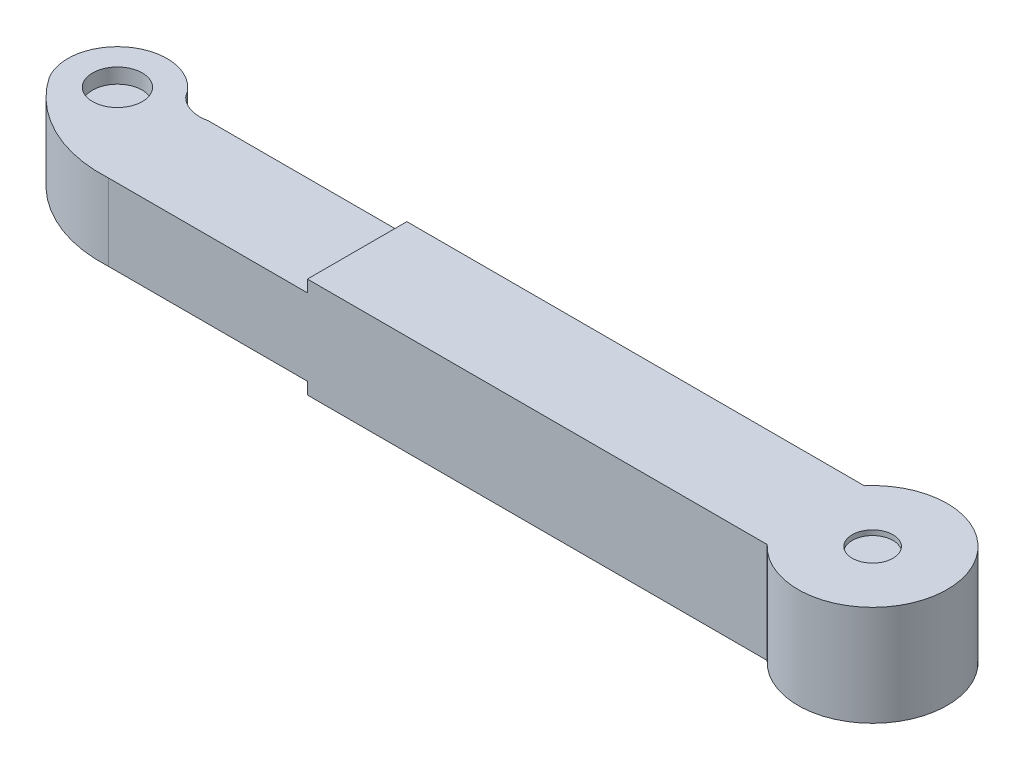
ISO-10303-21;
HEADER;
FILE_DESCRIPTION(('STEP AP214'),'2;1');
FILE_NAME('part.step','',(''),(''),'','','');
FILE_SCHEMA(('AUTOMOTIVE_DESIGN { 1 0 10303 214 1 1 1 1 }'));
ENDSEC;
DATA;
#1=APPLICATION_CONTEXT('core data for automotive mechanical design processes');
#2=APPLICATION_PROTOCOL_DEFINITION('international standard','automotive_design',2000,#1);
#3=PRODUCT_CONTEXT('',#1,'mechanical');
#4=PRODUCT('Part','Part','',(#3));
#5=PRODUCT_RELATED_PRODUCT_CATEGORY('part','',(#4));
#6=PRODUCT_DEFINITION_FORMATION('','',#4);
#7=PRODUCT_DEFINITION_CONTEXT('part definition',#1,'design');
#8=PRODUCT_DEFINITION('design','',#6,#7);
#9=PRODUCT_DEFINITION_SHAPE('','',#8);
#10=(LENGTH_UNIT() NAMED_UNIT(*) SI_UNIT(.MILLI.,.METRE.));
#11=(NAMED_UNIT(*) PLANE_ANGLE_UNIT() SI_UNIT($,.RADIAN.));
#12=(NAMED_UNIT(*) SI_UNIT($,.STERADIAN.) SOLID_ANGLE_UNIT());
#13=UNCERTAINTY_MEASURE_WITH_UNIT(LENGTH_MEASURE(1.E-05),#10,'distance_accuracy_value','');
#14=(GEOMETRIC_REPRESENTATION_CONTEXT(3) GLOBAL_UNCERTAINTY_ASSIGNED_CONTEXT((#13)) GLOBAL_UNIT_ASSIGNED_CONTEXT((#10,
#11,#12)) REPRESENTATION_CONTEXT('',''));
#15=CARTESIAN_POINT('',(0.,0.,0.));
#16=DIRECTION('',(0.,0.,1.));
#17=DIRECTION('',(1.,0.,0.));
#18=AXIS2_PLACEMENT_3D('',#15,#16,#17);
#19=CARTESIAN_POINT('',(33.3628123958381,10.1,5.01996462768105));
#20=DIRECTION('',(0.,0.,-1.));
#21=DIRECTION('',(-1.,0.,0.));
#22=AXIS2_PLACEMENT_3D('',#19,#20,#21);
#23=PLANE('',#22);
#24=DIRECTION('',(1.,0.,0.));
#25=VECTOR('',#24,1.);
#26=CARTESIAN_POINT('',(-32.8682334573051,1.2,5.01996462768105));
#27=LINE('',#26,#25);
#28=CARTESIAN_POINT('',(-32.8682334573051,1.2,5.01996462768105));
#29=VERTEX_POINT('',#28);
#30=CARTESIAN_POINT('',(-12.8682334573051,1.2,5.01996462768105));
#31=VERTEX_POINT('',#30);
#32=EDGE_CURVE('E145',#29,#31,#27,.T.);
#33=ORIENTED_EDGE('',*,*,#32,.T.);
#34=DIRECTION('',(0.,-1.,0.));
#35=VECTOR('',#34,1.);
#36=CARTESIAN_POINT('',(-12.8682334573051,0.,5.01996462768105));
#37=LINE('',#36,#35);
#38=CARTESIAN_POINT('',(-12.8682334573051,0.,5.01996462768105));
#39=VERTEX_POINT('',#38);
#40=EDGE_CURVE('E168',#31,#39,#37,.T.);
#41=ORIENTED_EDGE('',*,*,#40,.T.);
#42=DIRECTION('',(1.,0.,0.));
#43=VECTOR('',#42,1.);
#44=CARTESIAN_POINT('',(33.3628123958381,0.,5.01996462768105));
#45=LINE('',#44,#43);
#46=CARTESIAN_POINT('',(33.3628123958381,0.,5.01996462768105));
#47=VERTEX_POINT('',#46);
#48=EDGE_CURVE('E204',#39,#47,#45,.T.);
#49=ORIENTED_EDGE('',*,*,#48,.T.);
#50=DIRECTION('',(0.,-1.,0.));
#51=VECTOR('',#50,1.);
#52=CARTESIAN_POINT('',(33.3628123958381,10.1,5.01996462768105));
#53=LINE('',#52,#51);
#54=CARTESIAN_POINT('',(33.3628123958381,10.1,5.01996462768105));
#55=VERTEX_POINT('',#54);
#56=EDGE_CURVE('E53',#55,#47,#53,.T.);
#57=ORIENTED_EDGE('',*,*,#56,.F.);
#58=DIRECTION('',(1.,0.,0.));
#59=VECTOR('',#58,1.);
#60=CARTESIAN_POINT('',(33.3628123958381,10.1,5.01996462768105));
#61=LINE('',#60,#59);
#62=CARTESIAN_POINT('',(-12.8682334573051,10.1,5.01996462768105));
#63=VERTEX_POINT('',#62);
#64=EDGE_CURVE('E207',#63,#55,#61,.T.);
#65=ORIENTED_EDGE('',*,*,#64,.F.);
#66=DIRECTION('',(0.,1.,0.));
#67=VECTOR('',#66,1.);
#68=CARTESIAN_POINT('',(-12.8682334573051,10.1,5.01996462768105));
#69=LINE('',#68,#67);
#70=CARTESIAN_POINT('',(-12.8682334573051,8.9,5.01996462768105));
#71=VERTEX_POINT('',#70);
#72=EDGE_CURVE('E68',#71,#63,#69,.T.);
#73=ORIENTED_EDGE('',*,*,#72,.F.);
#74=DIRECTION('',(1.,0.,0.));
#75=VECTOR('',#74,1.);
#76=CARTESIAN_POINT('',(-32.8682334573051,8.9,5.01996462768105));
#77=LINE('',#76,#75);
#78=CARTESIAN_POINT('',(-32.8682334573051,8.9,5.01996462768105));
#79=VERTEX_POINT('',#78);
#80=EDGE_CURVE('E184',#79,#71,#77,.T.);
#81=ORIENTED_EDGE('',*,*,#80,.F.);
#82=DIRECTION('',(0.,-1.,0.));
#83=VECTOR('',#82,1.);
#84=CARTESIAN_POINT('',(-32.8682334573051,10.1,5.01996462768106));
#85=LINE('',#84,#83);
#86=EDGE_CURVE('E11',#79,#29,#85,.T.);
#87=ORIENTED_EDGE('',*,*,#86,.T.);
#88=EDGE_LOOP('',(#33,#41,#49,#57,#65,#73,#81,#87));
#89=FACE_BOUND('',#88,.T.);
#90=ADVANCED_FACE('F45',(#89),#23,.F.);
#91=CARTESIAN_POINT('',(33.1317665426949,10.1,-4.98003537231895));
#92=DIRECTION('',(0.,0.,1.));
#93=DIRECTION('',(1.,0.,0.));
#94=AXIS2_PLACEMENT_3D('',#91,#92,#93);
#95=PLANE('',#94);
#96=DIRECTION('',(1.,0.,0.));
#97=VECTOR('',#96,1.);
#98=CARTESIAN_POINT('',(-32.8682334573051,1.2,-4.98003537231895));
#99=LINE('',#98,#97);
#100=CARTESIAN_POINT('',(-32.8682334573051,1.2,-4.98003537231895));
#101=VERTEX_POINT('',#100);
#102=CARTESIAN_POINT('',(-12.8682334573051,1.2,-4.98003537231895));
#103=VERTEX_POINT('',#102);
#104=EDGE_CURVE('E172',#101,#103,#99,.T.);
#105=ORIENTED_EDGE('',*,*,#104,.F.);
#106=DIRECTION('',(0.,-1.,0.));
#107=VECTOR('',#106,1.);
#108=CARTESIAN_POINT('',(-32.8682334573051,10.1,-4.98003537231895));
#109=LINE('',#108,#107);
#110=CARTESIAN_POINT('',(-32.8682334573051,8.9,-4.98003537231895));
#111=VERTEX_POINT('',#110);
#112=EDGE_CURVE('E218',#111,#101,#109,.T.);
#113=ORIENTED_EDGE('',*,*,#112,.F.);
#114=DIRECTION('',(1.,0.,0.));
#115=VECTOR('',#114,1.);
#116=CARTESIAN_POINT('',(-32.8682334573051,8.9,-4.98003537231895));
#117=LINE('',#116,#115);
#118=CARTESIAN_POINT('',(-12.8682334573051,8.9,-4.98003537231895));
#119=VERTEX_POINT('',#118);
#120=EDGE_CURVE('E187',#111,#119,#117,.T.);
#121=ORIENTED_EDGE('',*,*,#120,.T.);
#122=DIRECTION('',(0.,1.,0.));
#123=VECTOR('',#122,1.);
#124=CARTESIAN_POINT('',(-12.8682334573051,10.1,-4.98003537231895));
#125=LINE('',#124,#123);
#126=CARTESIAN_POINT('',(-12.8682334573051,10.1,-4.98003537231895));
#127=VERTEX_POINT('',#126);
#128=EDGE_CURVE('E191',#119,#127,#125,.T.);
#129=ORIENTED_EDGE('',*,*,#128,.T.);
#130=DIRECTION('',(-1.,0.,0.));
#131=VECTOR('',#130,1.);
#132=CARTESIAN_POINT('',(33.1317665426949,10.1,-4.98003537231895));
#133=LINE('',#132,#131);
#134=CARTESIAN_POINT('',(33.1317665426949,10.1,-4.98003537231895));
#135=VERTEX_POINT('',#134);
#136=EDGE_CURVE('E214',#135,#127,#133,.T.);
#137=ORIENTED_EDGE('',*,*,#136,.F.);
#138=DIRECTION('',(0.,-1.,0.));
#139=VECTOR('',#138,1.);
#140=CARTESIAN_POINT('',(33.1317665426949,10.1,-4.98003537231895));
#141=LINE('',#140,#139);
#142=CARTESIAN_POINT('',(33.1317665426949,0.,-4.98003537231895));
#143=VERTEX_POINT('',#142);
#144=EDGE_CURVE('E230',#135,#143,#141,.T.);
#145=ORIENTED_EDGE('',*,*,#144,.T.);
#146=DIRECTION('',(-1.,0.,0.));
#147=VECTOR('',#146,1.);
#148=CARTESIAN_POINT('',(33.1317665426949,0.,-4.98003537231895));
#149=LINE('',#148,#147);
#150=CARTESIAN_POINT('',(-12.8682334573051,0.,-4.98003537231895));
#151=VERTEX_POINT('',#150);
#152=EDGE_CURVE('E211',#143,#151,#149,.T.);
#153=ORIENTED_EDGE('',*,*,#152,.T.);
#154=DIRECTION('',(0.,-1.,0.));
#155=VECTOR('',#154,1.);
#156=CARTESIAN_POINT('',(-12.8682334573051,0.,-4.98003537231895));
#157=LINE('',#156,#155);
#158=EDGE_CURVE('E60',#103,#151,#157,.T.);
#159=ORIENTED_EDGE('',*,*,#158,.F.);
#160=EDGE_LOOP('',(#105,#113,#121,#129,#137,#145,#153,#159));
#161=FACE_BOUND('',#160,.T.);
#162=ADVANCED_FACE('F248',(#161),#95,.F.);
#163=CARTESIAN_POINT('',(38.83477446173,0.,-0.109131896019785));
#164=DIRECTION('',(0.,-1.,0.));
#165=DIRECTION('',(0.,0.,-1.));
#166=AXIS2_PLACEMENT_3D('',#163,#164,#165);
#167=PLANE('',#166);
#168=ORIENTED_EDGE('',*,*,#48,.F.);
#169=DIRECTION('',(0.,0.,1.));
#170=VECTOR('',#169,1.);
#171=CARTESIAN_POINT('',(-12.8682334573051,0.,-4.98003537231895));
#172=LINE('',#171,#170);
#173=EDGE_CURVE('E175',#151,#39,#172,.T.);
#174=ORIENTED_EDGE('',*,*,#173,.F.);
#175=ORIENTED_EDGE('',*,*,#152,.F.);
#176=CARTESIAN_POINT('',(38.83477446173,0.,-0.109131896019785));
#177=DIRECTION('',(0.,1.,0.));
#178=DIRECTION('',(0.,0.,-1.));
#179=AXIS2_PLACEMENT_3D('',#176,#177,#178);
#180=CIRCLE('',#179,7.5);
#181=EDGE_CURVE('E221',#47,#143,#180,.T.);
#182=ORIENTED_EDGE('',*,*,#181,.F.);
#183=EDGE_LOOP('',(#168,#174,#175,#182));
#184=FACE_BOUND('',#183,.T.);
#185=ADVANCED_FACE('F246',(#184),#167,.T.);
#186=CARTESIAN_POINT('',(38.83477446173,10.1,-0.109131896019785));
#187=DIRECTION('',(0.,-1.,0.));
#188=DIRECTION('',(0.,0.,-1.));
#189=AXIS2_PLACEMENT_3D('',#186,#187,#188);
#190=CYLINDRICAL_SURFACE('',#189,7.5);
#191=ORIENTED_EDGE('',*,*,#181,.T.);
#192=ORIENTED_EDGE('',*,*,#144,.F.);
#193=CARTESIAN_POINT('',(38.83477446173,10.1,-0.109131896019785));
#194=DIRECTION('',(0.,1.,0.));
#195=DIRECTION('',(0.,0.,-1.));
#196=AXIS2_PLACEMENT_3D('',#193,#194,#195);
#197=CIRCLE('',#196,7.5);
#198=EDGE_CURVE('E210',#55,#135,#197,.T.);
#199=ORIENTED_EDGE('',*,*,#198,.F.);
#200=ORIENTED_EDGE('',*,*,#56,.T.);
#201=EDGE_LOOP('',(#191,#192,#199,#200));
#202=FACE_BOUND('',#201,.T.);
#203=ADVANCED_FACE('F239',(#202),#190,.T.);
#204=CARTESIAN_POINT('',(38.83477446173,10.1,-0.109131896019785));
#205=DIRECTION('',(0.,-1.,0.));
#206=DIRECTION('',(0.,0.,-1.));
#207=AXIS2_PLACEMENT_3D('',#204,#205,#206);
#208=PLANE('',#207);
#209=CARTESIAN_POINT('',(38.83477446173,10.1,-0.109131896019785));
#210=DIRECTION('',(0.,1.,0.));
#211=DIRECTION('',(0.,0.,1.));
#212=AXIS2_PLACEMENT_3D('',#209,#210,#211);
#213=CIRCLE('',#212,2.04999999999999);
#214=CARTESIAN_POINT('',(38.83477446173,10.1,1.94086810398021));
#215=VERTEX_POINT('',#214);
#216=EDGE_CURVE('E318',#215,#215,#213,.T.);
#217=ORIENTED_EDGE('',*,*,#216,.F.);
#218=EDGE_LOOP('',(#217));
#219=FACE_BOUND('',#218,.T.);
#220=ORIENTED_EDGE('',*,*,#136,.T.);
#221=DIRECTION('',(0.,0.,1.));
#222=VECTOR('',#221,1.);
#223=CARTESIAN_POINT('',(-12.8682334573051,10.1,-4.98003537231895));
#224=LINE('',#223,#222);
#225=EDGE_CURVE('E201',#127,#63,#224,.T.);
#226=ORIENTED_EDGE('',*,*,#225,.T.);
#227=ORIENTED_EDGE('',*,*,#64,.T.);
#228=ORIENTED_EDGE('',*,*,#198,.T.);
#229=EDGE_LOOP('',(#220,#226,#227,#228));
#230=FACE_BOUND('',#229,.T.);
#231=ADVANCED_FACE('F252',(#219,#230),#208,.F.);
#232=CARTESIAN_POINT('',(-12.8682334573051,10.1,-4.98003537231895));
#233=DIRECTION('',(1.,0.,0.));
#234=DIRECTION('',(0.,0.,-1.));
#235=AXIS2_PLACEMENT_3D('',#232,#233,#234);
#236=PLANE('',#235);
#237=ORIENTED_EDGE('',*,*,#72,.T.);
#238=ORIENTED_EDGE('',*,*,#225,.F.);
#239=ORIENTED_EDGE('',*,*,#128,.F.);
#240=DIRECTION('',(0.,0.,1.));
#241=VECTOR('',#240,1.);
#242=CARTESIAN_POINT('',(-12.8682334573051,8.9,-4.98003537231895));
#243=LINE('',#242,#241);
#244=EDGE_CURVE('E195',#119,#71,#243,.T.);
#245=ORIENTED_EDGE('',*,*,#244,.T.);
#246=EDGE_LOOP('',(#237,#238,#239,#245));
#247=FACE_BOUND('',#246,.T.);
#248=ADVANCED_FACE('F286',(#247),#236,.F.);
#249=CARTESIAN_POINT('',(-32.8682334573051,8.9,-4.98003537231895));
#250=DIRECTION('',(0.,-1.,0.));
#251=DIRECTION('',(0.,0.,-1.));
#252=AXIS2_PLACEMENT_3D('',#249,#250,#251);
#253=PLANE('',#252);
#254=CARTESIAN_POINT('',(-40.3231501848956,8.9,-3.33066797811563));
#255=DIRECTION('',(0.,1.,0.));
#256=DIRECTION('',(0.,0.,1.));
#257=AXIS2_PLACEMENT_3D('',#254,#255,#256);
#258=CIRCLE('',#257,2.5);
#259=CARTESIAN_POINT('',(-40.3231501848956,8.9,-0.830667978115633));
#260=VERTEX_POINT('',#259);
#261=EDGE_CURVE('E156',#260,#260,#258,.T.);
#262=ORIENTED_EDGE('',*,*,#261,.F.);
#263=EDGE_LOOP('',(#262));
#264=FACE_BOUND('',#263,.T.);
#265=ORIENTED_EDGE('',*,*,#80,.T.);
#266=ORIENTED_EDGE('',*,*,#244,.F.);
#267=ORIENTED_EDGE('',*,*,#120,.F.);
#268=CARTESIAN_POINT('',(-33.6279704702933,8.9,-8.25831838146948));
#269=DIRECTION('',(0.,-1.,0.));
#270=DIRECTION('',(0.,0.,1.));
#271=AXIS2_PLACEMENT_3D('',#268,#269,#270);
#272=CIRCLE('',#271,3.36516564480701);
#273=CARTESIAN_POINT('',(-36.042240479619,8.9,-5.91404021131557));
#274=VERTEX_POINT('',#273);
#275=EDGE_CURVE('E150',#111,#274,#272,.T.);
#276=ORIENTED_EDGE('',*,*,#275,.T.);
#277=CARTESIAN_POINT('',(-40.3231501848956,8.9,-3.33066797811563));
#278=DIRECTION('',(0.,1.,0.));
#279=DIRECTION('',(0.,0.,1.));
#280=AXIS2_PLACEMENT_3D('',#277,#278,#279);
#281=CIRCLE('',#280,5.);
#282=CARTESIAN_POINT('',(-44.6040598901724,8.9,-0.747295744915947));
#283=VERTEX_POINT('',#282);
#284=EDGE_CURVE('E161',#274,#283,#281,.T.);
#285=ORIENTED_EDGE('',*,*,#284,.T.);
#286=CARTESIAN_POINT('',(-33.6279704702933,8.9,-8.25831838146948));
#287=DIRECTION('',(0.,1.,0.));
#288=DIRECTION('',(0.,0.,1.));
#289=AXIS2_PLACEMENT_3D('',#286,#287,#288);
#290=CIRCLE('',#289,13.3);
#291=EDGE_CURVE('E129',#283,#79,#290,.T.);
#292=ORIENTED_EDGE('',*,*,#291,.T.);
#293=EDGE_LOOP('',(#265,#266,#267,#276,#285,#292));
#294=FACE_BOUND('',#293,.T.);
#295=ADVANCED_FACE('F254',(#264,#294),#253,.F.);
#296=CARTESIAN_POINT('',(-32.8682334573051,1.2,-4.98003537231895));
#297=DIRECTION('',(0.,-1.,0.));
#298=DIRECTION('',(0.,0.,-1.));
#299=AXIS2_PLACEMENT_3D('',#296,#297,#298);
#300=PLANE('',#299);
#301=CARTESIAN_POINT('',(-40.3231501848956,1.2,-3.33066797811563));
#302=DIRECTION('',(0.,1.,0.));
#303=DIRECTION('',(0.,0.,1.));
#304=AXIS2_PLACEMENT_3D('',#301,#302,#303);
#305=CIRCLE('',#304,2.5);
#306=CARTESIAN_POINT('',(-40.3231501848956,1.2,-0.830667978115633));
#307=VERTEX_POINT('',#306);
#308=EDGE_CURVE('E309',#307,#307,#305,.T.);
#309=ORIENTED_EDGE('',*,*,#308,.T.);
#310=EDGE_LOOP('',(#309));
#311=FACE_BOUND('',#310,.T.);
#312=ORIENTED_EDGE('',*,*,#32,.F.);
#313=CARTESIAN_POINT('',(-33.6279704702933,1.2,-8.25831838146948));
#314=DIRECTION('',(0.,1.,0.));
#315=DIRECTION('',(0.,0.,1.));
#316=AXIS2_PLACEMENT_3D('',#313,#314,#315);
#317=CIRCLE('',#316,13.3);
#318=CARTESIAN_POINT('',(-44.6040598901724,1.2,-0.747295744915947));
#319=VERTEX_POINT('',#318);
#320=EDGE_CURVE('E127',#319,#29,#317,.T.);
#321=ORIENTED_EDGE('',*,*,#320,.F.);
#322=CARTESIAN_POINT('',(-40.3231501848956,1.2,-3.33066797811563));
#323=DIRECTION('',(0.,1.,0.));
#324=DIRECTION('',(0.,0.,1.));
#325=AXIS2_PLACEMENT_3D('',#322,#323,#324);
#326=CIRCLE('',#325,5.);
#327=CARTESIAN_POINT('',(-36.042240479619,1.2,-5.91404021131557));
#328=VERTEX_POINT('',#327);
#329=EDGE_CURVE('E142',#328,#319,#326,.T.);
#330=ORIENTED_EDGE('',*,*,#329,.F.);
#331=CARTESIAN_POINT('',(-33.6279704702933,1.2,-8.25831838146948));
#332=DIRECTION('',(0.,-1.,0.));
#333=DIRECTION('',(0.,0.,1.));
#334=AXIS2_PLACEMENT_3D('',#331,#332,#333);
#335=CIRCLE('',#334,3.36516564480701);
#336=EDGE_CURVE('E136',#101,#328,#335,.T.);
#337=ORIENTED_EDGE('',*,*,#336,.F.);
#338=ORIENTED_EDGE('',*,*,#104,.T.);
#339=DIRECTION('',(0.,0.,1.));
#340=VECTOR('',#339,1.);
#341=CARTESIAN_POINT('',(-12.8682334573051,1.2,-4.98003537231895));
#342=LINE('',#341,#340);
#343=EDGE_CURVE('E181',#103,#31,#342,.T.);
#344=ORIENTED_EDGE('',*,*,#343,.T.);
#345=EDGE_LOOP('',(#312,#321,#330,#337,#338,#344));
#346=FACE_BOUND('',#345,.T.);
#347=ADVANCED_FACE('F140',(#311,#346),#300,.T.);
#348=CARTESIAN_POINT('',(-12.8682334573051,0.,-4.98003537231895));
#349=DIRECTION('',(-1.,0.,0.));
#350=DIRECTION('',(0.,0.,1.));
#351=AXIS2_PLACEMENT_3D('',#348,#349,#350);
#352=PLANE('',#351);
#353=ORIENTED_EDGE('',*,*,#40,.F.);
#354=ORIENTED_EDGE('',*,*,#343,.F.);
#355=ORIENTED_EDGE('',*,*,#158,.T.);
#356=ORIENTED_EDGE('',*,*,#173,.T.);
#357=EDGE_LOOP('',(#353,#354,#355,#356));
#358=FACE_BOUND('',#357,.T.);
#359=ADVANCED_FACE('F260',(#358),#352,.T.);
#360=CARTESIAN_POINT('',(-40.3231501848956,1.2,-3.33066797811563));
#361=DIRECTION('',(0.,1.,0.));
#362=DIRECTION('',(0.,0.,1.));
#363=AXIS2_PLACEMENT_3D('',#360,#361,#362);
#364=CYLINDRICAL_SURFACE('',#363,5.);
#365=ORIENTED_EDGE('',*,*,#284,.F.);
#366=DIRECTION('',(0.,1.,0.));
#367=VECTOR('',#366,1.);
#368=CARTESIAN_POINT('',(-36.042240479619,1.2,-5.91404021131557));
#369=LINE('',#368,#367);
#370=EDGE_CURVE('E135',#328,#274,#369,.T.);
#371=ORIENTED_EDGE('',*,*,#370,.F.);
#372=ORIENTED_EDGE('',*,*,#329,.T.);
#373=DIRECTION('',(0.,1.,0.));
#374=VECTOR('',#373,1.);
#375=CARTESIAN_POINT('',(-44.6040598901724,1.2,-0.747295744915947));
#376=LINE('',#375,#374);
#377=EDGE_CURVE('E123',#319,#283,#376,.T.);
#378=ORIENTED_EDGE('',*,*,#377,.T.);
#379=EDGE_LOOP('',(#365,#371,#372,#378));
#380=FACE_BOUND('',#379,.T.);
#381=ADVANCED_FACE('F148',(#380),#364,.T.);
#382=CARTESIAN_POINT('',(-33.6279704702933,1.2,-8.25831838146948));
#383=DIRECTION('',(0.,1.,0.));
#384=DIRECTION('',(0.,0.,1.));
#385=AXIS2_PLACEMENT_3D('',#382,#383,#384);
#386=CYLINDRICAL_SURFACE('',#385,3.36516564480701);
#387=ORIENTED_EDGE('',*,*,#275,.F.);
#388=ORIENTED_EDGE('',*,*,#112,.T.);
#389=ORIENTED_EDGE('',*,*,#336,.T.);
#390=ORIENTED_EDGE('',*,*,#370,.T.);
#391=EDGE_LOOP('',(#387,#388,#389,#390));
#392=FACE_BOUND('',#391,.T.);
#393=ADVANCED_FACE('F258',(#392),#386,.F.);
#394=CARTESIAN_POINT('',(-33.6279704702933,1.2,-8.25831838146948));
#395=DIRECTION('',(0.,1.,0.));
#396=DIRECTION('',(0.,0.,1.));
#397=AXIS2_PLACEMENT_3D('',#394,#395,#396);
#398=CYLINDRICAL_SURFACE('',#397,13.3);
#399=ORIENTED_EDGE('',*,*,#291,.F.);
#400=ORIENTED_EDGE('',*,*,#377,.F.);
#401=ORIENTED_EDGE('',*,*,#320,.T.);
#402=ORIENTED_EDGE('',*,*,#86,.F.);
#403=EDGE_LOOP('',(#399,#400,#401,#402));
#404=FACE_BOUND('',#403,.T.);
#405=ADVANCED_FACE('F125',(#404),#398,.T.);
#406=CARTESIAN_POINT('',(-40.3231501848956,7.4,-3.33066797811563));
#407=DIRECTION('',(0.,1.,0.));
#408=DIRECTION('',(0.,0.,1.));
#409=AXIS2_PLACEMENT_3D('',#406,#407,#408);
#410=CYLINDRICAL_SURFACE('',#409,2.5);
#411=CARTESIAN_POINT('',(-40.3231501848956,7.4,-3.33066797811563));
#412=DIRECTION('',(0.,1.,0.));
#413=DIRECTION('',(0.,0.,1.));
#414=AXIS2_PLACEMENT_3D('',#411,#412,#413);
#415=CIRCLE('',#414,2.5);
#416=CARTESIAN_POINT('',(-40.3231501848956,7.4,-0.830667978115633));
#417=VERTEX_POINT('',#416);
#418=EDGE_CURVE('E164',#417,#417,#415,.T.);
#419=ORIENTED_EDGE('',*,*,#418,.F.);
#420=EDGE_LOOP('',(#419));
#421=FACE_BOUND('',#420,.T.);
#422=ORIENTED_EDGE('',*,*,#261,.T.);
#423=EDGE_LOOP('',(#422));
#424=FACE_BOUND('',#423,.T.);
#425=ADVANCED_FACE('F345',(#421,#424),#410,.F.);
#426=CARTESIAN_POINT('',(-40.3231501848956,7.4,-3.33066797811563));
#427=DIRECTION('',(0.,1.,0.));
#428=DIRECTION('',(0.,0.,1.));
#429=AXIS2_PLACEMENT_3D('',#426,#427,#428);
#430=PLANE('',#429);
#431=ORIENTED_EDGE('',*,*,#418,.T.);
#432=EDGE_LOOP('',(#431));
#433=FACE_BOUND('',#432,.T.);
#434=ADVANCED_FACE('F342',(#433),#430,.T.);
#435=CARTESIAN_POINT('',(-40.3231501848956,2.7,-3.33066797811563));
#436=DIRECTION('',(0.,-1.,0.));
#437=DIRECTION('',(0.,0.,-1.));
#438=AXIS2_PLACEMENT_3D('',#435,#436,#437);
#439=CYLINDRICAL_SURFACE('',#438,2.5);
#440=CARTESIAN_POINT('',(-40.3231501848956,2.7,-3.33066797811563));
#441=DIRECTION('',(0.,1.,0.));
#442=DIRECTION('',(0.,0.,1.));
#443=AXIS2_PLACEMENT_3D('',#440,#441,#442);
#444=CIRCLE('',#443,2.5);
#445=CARTESIAN_POINT('',(-40.3231501848956,2.7,-0.830667978115633));
#446=VERTEX_POINT('',#445);
#447=EDGE_CURVE('E304',#446,#446,#444,.T.);
#448=ORIENTED_EDGE('',*,*,#447,.T.);
#449=EDGE_LOOP('',(#448));
#450=FACE_BOUND('',#449,.T.);
#451=ORIENTED_EDGE('',*,*,#308,.F.);
#452=EDGE_LOOP('',(#451));
#453=FACE_BOUND('',#452,.T.);
#454=ADVANCED_FACE('F336',(#450,#453),#439,.F.);
#455=CARTESIAN_POINT('',(-40.3231501848956,2.7,-3.33066797811563));
#456=DIRECTION('',(0.,-1.,0.));
#457=DIRECTION('',(0.,0.,1.));
#458=AXIS2_PLACEMENT_3D('',#455,#456,#457);
#459=PLANE('',#458);
#460=ORIENTED_EDGE('',*,*,#447,.F.);
#461=EDGE_LOOP('',(#460));
#462=FACE_BOUND('',#461,.T.);
#463=ADVANCED_FACE('F330',(#462),#459,.T.);
#464=CARTESIAN_POINT('',(38.83477446173,9.6,-0.109131896019785));
#465=DIRECTION('',(0.,1.,0.));
#466=DIRECTION('',(0.,0.,1.));
#467=AXIS2_PLACEMENT_3D('',#464,#465,#466);
#468=CYLINDRICAL_SURFACE('',#467,2.04999999999999);
#469=CARTESIAN_POINT('',(38.83477446173,9.6,-0.109131896019785));
#470=DIRECTION('',(0.,1.,0.));
#471=DIRECTION('',(0.,0.,1.));
#472=AXIS2_PLACEMENT_3D('',#469,#470,#471);
#473=CIRCLE('',#472,2.04999999999999);
#474=CARTESIAN_POINT('',(38.83477446173,9.6,1.94086810398021));
#475=VERTEX_POINT('',#474);
#476=EDGE_CURVE('E315',#475,#475,#473,.T.);
#477=ORIENTED_EDGE('',*,*,#476,.F.);
#478=EDGE_LOOP('',(#477));
#479=FACE_BOUND('',#478,.T.);
#480=ORIENTED_EDGE('',*,*,#216,.T.);
#481=EDGE_LOOP('',(#480));
#482=FACE_BOUND('',#481,.T.);
#483=ADVANCED_FACE('F328',(#479,#482),#468,.F.);
#484=CARTESIAN_POINT('',(38.83477446173,9.6,-0.109131896019785));
#485=DIRECTION('',(0.,1.,0.));
#486=DIRECTION('',(0.,0.,1.));
#487=AXIS2_PLACEMENT_3D('',#484,#485,#486);
#488=PLANE('',#487);
#489=ORIENTED_EDGE('',*,*,#476,.T.);
#490=EDGE_LOOP('',(#489));
#491=FACE_BOUND('',#490,.T.);
#492=ADVANCED_FACE('F326',(#491),#488,.T.);
#493=CLOSED_SHELL('',(#90,#162,#185,#203,#231,#248,#295,#347,#359,#381,#393,#405,#425,#434,#454,
#463,#483,#492));
#494=MANIFOLD_SOLID_BREP('B2',#493);
#495=ADVANCED_BREP_SHAPE_REPRESENTATION('',(#18,#494),#14);
#496=SHAPE_DEFINITION_REPRESENTATION(#9,#495);
ENDSEC;
END-ISO-10303-21;
